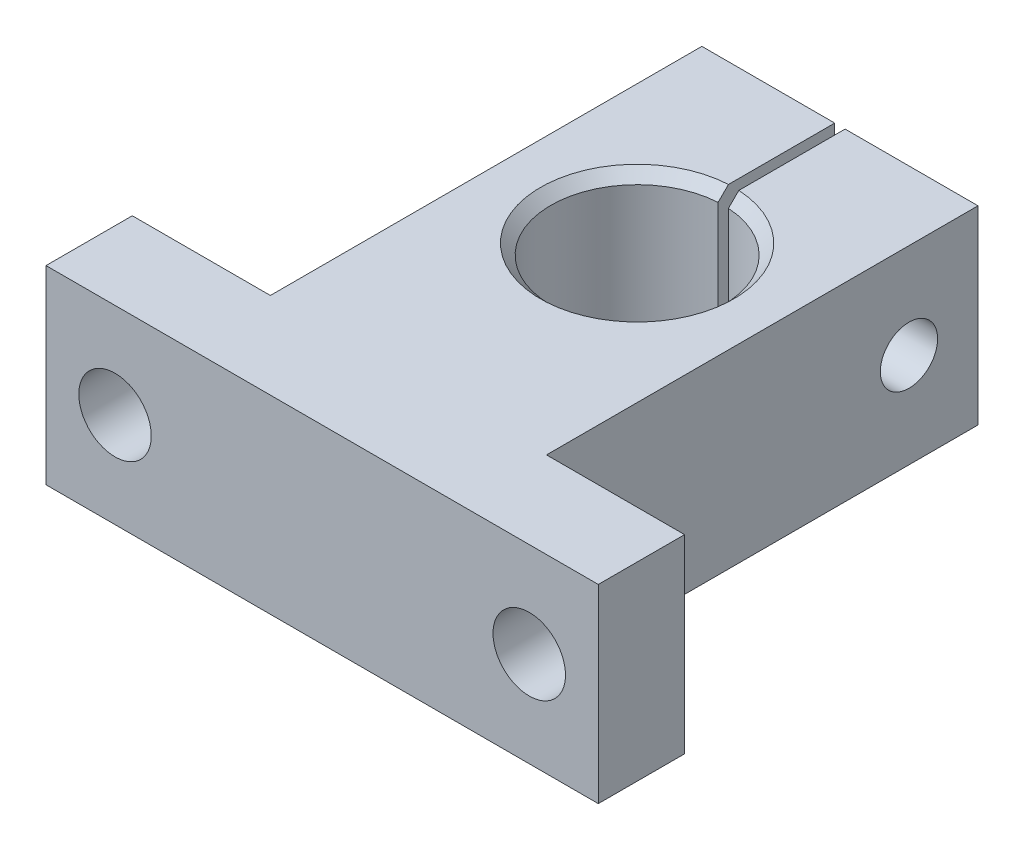
ISO-10303-21;
HEADER;
FILE_DESCRIPTION(('STEP AP214'),'2;1');
FILE_NAME('part.step','',(''),(''),'','','');
FILE_SCHEMA(('AUTOMOTIVE_DESIGN { 1 0 10303 214 1 1 1 1 }'));
ENDSEC;
DATA;
#1=APPLICATION_CONTEXT('core data for automotive mechanical design processes');
#2=APPLICATION_PROTOCOL_DEFINITION('international standard','automotive_design',2000,#1);
#3=PRODUCT_CONTEXT('',#1,'mechanical');
#4=PRODUCT('Part','Part','',(#3));
#5=PRODUCT_RELATED_PRODUCT_CATEGORY('part','',(#4));
#6=PRODUCT_DEFINITION_FORMATION('','',#4);
#7=PRODUCT_DEFINITION_CONTEXT('part definition',#1,'design');
#8=PRODUCT_DEFINITION('design','',#6,#7);
#9=PRODUCT_DEFINITION_SHAPE('','',#8);
#10=(LENGTH_UNIT() NAMED_UNIT(*) SI_UNIT(.MILLI.,.METRE.));
#11=(NAMED_UNIT(*) PLANE_ANGLE_UNIT() SI_UNIT($,.RADIAN.));
#12=(NAMED_UNIT(*) SI_UNIT($,.STERADIAN.) SOLID_ANGLE_UNIT());
#13=UNCERTAINTY_MEASURE_WITH_UNIT(LENGTH_MEASURE(1.E-05),#10,'distance_accuracy_value','');
#14=(GEOMETRIC_REPRESENTATION_CONTEXT(3) GLOBAL_UNCERTAINTY_ASSIGNED_CONTEXT((#13)) GLOBAL_UNIT_ASSIGNED_CONTEXT((#10,
#11,#12)) REPRESENTATION_CONTEXT('',''));
#15=CARTESIAN_POINT('',(0.,0.,0.));
#16=DIRECTION('',(0.,0.,1.));
#17=DIRECTION('',(1.,0.,0.));
#18=AXIS2_PLACEMENT_3D('',#15,#16,#17);
#19=CARTESIAN_POINT('',(20.32,13.97,23.1775));
#20=DIRECTION('',(0.,0.,-1.));
#21=DIRECTION('',(-1.,0.,0.));
#22=AXIS2_PLACEMENT_3D('',#19,#20,#21);
#23=PLANE('',#22);
#24=CARTESIAN_POINT('',(15.24,6.985,23.1775));
#25=DIRECTION('',(0.,0.,-1.));
#26=DIRECTION('',(-1.,0.,0.));
#27=AXIS2_PLACEMENT_3D('',#24,#25,#26);
#28=CIRCLE('',#27,2.667);
#29=CARTESIAN_POINT('',(12.573,6.985,23.1775));
#30=VERTEX_POINT('',#29);
#31=EDGE_CURVE('E337',#30,#30,#28,.T.);
#32=ORIENTED_EDGE('',*,*,#31,.T.);
#33=EDGE_LOOP('',(#32));
#34=FACE_BOUND('',#33,.T.);
#35=CARTESIAN_POINT('',(-15.24,6.985,23.1775));
#36=DIRECTION('',(0.,0.,-1.));
#37=DIRECTION('',(-1.,0.,0.));
#38=AXIS2_PLACEMENT_3D('',#35,#36,#37);
#39=CIRCLE('',#38,2.667);
#40=CARTESIAN_POINT('',(-17.907,6.985,23.1775));
#41=VERTEX_POINT('',#40);
#42=EDGE_CURVE('E431',#41,#41,#39,.T.);
#43=ORIENTED_EDGE('',*,*,#42,.T.);
#44=EDGE_LOOP('',(#43));
#45=FACE_BOUND('',#44,.T.);
#46=DIRECTION('',(1.,0.,0.));
#47=VECTOR('',#46,1.);
#48=CARTESIAN_POINT('',(20.32,0.,23.1775));
#49=LINE('',#48,#47);
#50=CARTESIAN_POINT('',(-20.32,0.,23.1775));
#51=VERTEX_POINT('',#50);
#52=CARTESIAN_POINT('',(20.32,0.,23.1775));
#53=VERTEX_POINT('',#52);
#54=EDGE_CURVE('E164',#51,#53,#49,.T.);
#55=ORIENTED_EDGE('',*,*,#54,.T.);
#56=DIRECTION('',(0.,-1.,0.));
#57=VECTOR('',#56,1.);
#58=CARTESIAN_POINT('',(20.32,13.97,23.1775));
#59=LINE('',#58,#57);
#60=CARTESIAN_POINT('',(20.32,13.97,23.1775));
#61=VERTEX_POINT('',#60);
#62=EDGE_CURVE('E145',#61,#53,#59,.T.);
#63=ORIENTED_EDGE('',*,*,#62,.F.);
#64=DIRECTION('',(1.,0.,0.));
#65=VECTOR('',#64,1.);
#66=CARTESIAN_POINT('',(20.32,13.97,23.1775));
#67=LINE('',#66,#65);
#68=CARTESIAN_POINT('',(-20.32,13.97,23.1775));
#69=VERTEX_POINT('',#68);
#70=EDGE_CURVE('E152',#69,#61,#67,.T.);
#71=ORIENTED_EDGE('',*,*,#70,.F.);
#72=DIRECTION('',(0.,-1.,0.));
#73=VECTOR('',#72,1.);
#74=CARTESIAN_POINT('',(-20.32,13.97,23.1775));
#75=LINE('',#74,#73);
#76=EDGE_CURVE('E297',#69,#51,#75,.T.);
#77=ORIENTED_EDGE('',*,*,#76,.T.);
#78=EDGE_LOOP('',(#55,#63,#71,#77));
#79=FACE_BOUND('',#78,.T.);
#80=ADVANCED_FACE('F35',(#34,#45,#79),#23,.F.);
#81=CARTESIAN_POINT('',(20.32,13.97,16.8275));
#82=DIRECTION('',(-1.,0.,0.));
#83=DIRECTION('',(0.,0.,1.));
#84=AXIS2_PLACEMENT_3D('',#81,#82,#83);
#85=PLANE('',#84);
#86=DIRECTION('',(0.,0.,-1.));
#87=VECTOR('',#86,1.);
#88=CARTESIAN_POINT('',(20.32,0.,16.8275));
#89=LINE('',#88,#87);
#90=CARTESIAN_POINT('',(20.32,0.,16.8275));
#91=VERTEX_POINT('',#90);
#92=EDGE_CURVE('E336',#53,#91,#89,.T.);
#93=ORIENTED_EDGE('',*,*,#92,.T.);
#94=DIRECTION('',(0.,-1.,0.));
#95=VECTOR('',#94,1.);
#96=CARTESIAN_POINT('',(20.32,13.97,16.8275));
#97=LINE('',#96,#95);
#98=CARTESIAN_POINT('',(20.32,13.97,16.8275));
#99=VERTEX_POINT('',#98);
#100=EDGE_CURVE('E148',#99,#91,#97,.T.);
#101=ORIENTED_EDGE('',*,*,#100,.F.);
#102=DIRECTION('',(0.,0.,-1.));
#103=VECTOR('',#102,1.);
#104=CARTESIAN_POINT('',(20.32,13.97,16.8275));
#105=LINE('',#104,#103);
#106=EDGE_CURVE('E141',#61,#99,#105,.T.);
#107=ORIENTED_EDGE('',*,*,#106,.F.);
#108=ORIENTED_EDGE('',*,*,#62,.T.);
#109=EDGE_LOOP('',(#93,#101,#107,#108));
#110=FACE_BOUND('',#109,.T.);
#111=ADVANCED_FACE('F143',(#110),#85,.F.);
#112=CARTESIAN_POINT('',(10.16,13.97,16.8275));
#113=DIRECTION('',(0.,0.,1.));
#114=DIRECTION('',(1.,0.,0.));
#115=AXIS2_PLACEMENT_3D('',#112,#113,#114);
#116=PLANE('',#115);
#117=CARTESIAN_POINT('',(15.24,6.985,16.8275));
#118=DIRECTION('',(0.,0.,1.));
#119=DIRECTION('',(1.,0.,0.));
#120=AXIS2_PLACEMENT_3D('',#117,#118,#119);
#121=CIRCLE('',#120,3.42900000000002);
#122=CARTESIAN_POINT('',(18.669,6.985,16.8275));
#123=VERTEX_POINT('',#122);
#124=EDGE_CURVE('E374',#123,#123,#121,.T.);
#125=ORIENTED_EDGE('',*,*,#124,.T.);
#126=EDGE_LOOP('',(#125));
#127=FACE_BOUND('',#126,.T.);
#128=DIRECTION('',(-1.,0.,0.));
#129=VECTOR('',#128,1.);
#130=CARTESIAN_POINT('',(10.16,0.,16.8275));
#131=LINE('',#130,#129);
#132=CARTESIAN_POINT('',(10.16,0.,16.8275));
#133=VERTEX_POINT('',#132);
#134=EDGE_CURVE('E275',#91,#133,#131,.T.);
#135=ORIENTED_EDGE('',*,*,#134,.T.);
#136=DIRECTION('',(0.,-1.,0.));
#137=VECTOR('',#136,1.);
#138=CARTESIAN_POINT('',(10.16,13.97,16.8275));
#139=LINE('',#138,#137);
#140=CARTESIAN_POINT('',(10.16,13.97,16.8275));
#141=VERTEX_POINT('',#140);
#142=EDGE_CURVE('E169',#141,#133,#139,.T.);
#143=ORIENTED_EDGE('',*,*,#142,.F.);
#144=DIRECTION('',(-1.,0.,0.));
#145=VECTOR('',#144,1.);
#146=CARTESIAN_POINT('',(10.16,13.97,16.8275));
#147=LINE('',#146,#145);
#148=EDGE_CURVE('E151',#99,#141,#147,.T.);
#149=ORIENTED_EDGE('',*,*,#148,.F.);
#150=ORIENTED_EDGE('',*,*,#100,.T.);
#151=EDGE_LOOP('',(#135,#143,#149,#150));
#152=FACE_BOUND('',#151,.T.);
#153=ADVANCED_FACE('F249',(#127,#152),#116,.F.);
#154=CARTESIAN_POINT('',(10.16,13.97,-14.9225));
#155=DIRECTION('',(-1.,0.,0.));
#156=DIRECTION('',(0.,0.,1.));
#157=AXIS2_PLACEMENT_3D('',#154,#155,#156);
#158=PLANE('',#157);
#159=CARTESIAN_POINT('',(10.16,6.985,-9.8425));
#160=DIRECTION('',(-1.,0.,0.));
#161=DIRECTION('',(0.,0.,1.));
#162=AXIS2_PLACEMENT_3D('',#159,#160,#161);
#163=CIRCLE('',#162,2.1082);
#164=CARTESIAN_POINT('',(10.16,6.985,-7.7343));
#165=VERTEX_POINT('',#164);
#166=EDGE_CURVE('E262',#165,#165,#163,.T.);
#167=ORIENTED_EDGE('',*,*,#166,.T.);
#168=EDGE_LOOP('',(#167));
#169=FACE_BOUND('',#168,.T.);
#170=DIRECTION('',(0.,0.,-1.));
#171=VECTOR('',#170,1.);
#172=CARTESIAN_POINT('',(10.16,0.,-14.9225));
#173=LINE('',#172,#171);
#174=CARTESIAN_POINT('',(10.16,0.,-14.9225));
#175=VERTEX_POINT('',#174);
#176=EDGE_CURVE('E266',#133,#175,#173,.T.);
#177=ORIENTED_EDGE('',*,*,#176,.T.);
#178=DIRECTION('',(0.,-1.,0.));
#179=VECTOR('',#178,1.);
#180=CARTESIAN_POINT('',(10.16,13.97,-14.9225));
#181=LINE('',#180,#179);
#182=CARTESIAN_POINT('',(10.16,13.97,-14.9225));
#183=VERTEX_POINT('',#182);
#184=EDGE_CURVE('E269',#183,#175,#181,.T.);
#185=ORIENTED_EDGE('',*,*,#184,.F.);
#186=DIRECTION('',(0.,0.,-1.));
#187=VECTOR('',#186,1.);
#188=CARTESIAN_POINT('',(10.16,13.97,-14.9225));
#189=LINE('',#188,#187);
#190=EDGE_CURVE('E325',#141,#183,#189,.T.);
#191=ORIENTED_EDGE('',*,*,#190,.F.);
#192=ORIENTED_EDGE('',*,*,#142,.T.);
#193=EDGE_LOOP('',(#177,#185,#191,#192));
#194=FACE_BOUND('',#193,.T.);
#195=ADVANCED_FACE('F251',(#169,#194),#158,.F.);
#196=CARTESIAN_POINT('',(10.16,13.97,-14.9225));
#197=DIRECTION('',(0.,0.,1.));
#198=DIRECTION('',(1.,0.,0.));
#199=AXIS2_PLACEMENT_3D('',#196,#197,#198);
#200=PLANE('',#199);
#201=DIRECTION('',(-1.,0.,0.));
#202=VECTOR('',#201,1.);
#203=CARTESIAN_POINT('',(10.16,0.,-14.9225));
#204=LINE('',#203,#202);
#205=CARTESIAN_POINT('',(0.381,0.,-14.9225));
#206=VERTEX_POINT('',#205);
#207=EDGE_CURVE('E274',#175,#206,#204,.T.);
#208=ORIENTED_EDGE('',*,*,#207,.T.);
#209=DIRECTION('',(0.,-1.,0.));
#210=VECTOR('',#209,1.);
#211=CARTESIAN_POINT('',(0.381,13.97,-14.9225));
#212=LINE('',#211,#210);
#213=CARTESIAN_POINT('',(0.381,13.97,-14.9225));
#214=VERTEX_POINT('',#213);
#215=EDGE_CURVE('E280',#214,#206,#212,.T.);
#216=ORIENTED_EDGE('',*,*,#215,.F.);
#217=DIRECTION('',(-1.,0.,0.));
#218=VECTOR('',#217,1.);
#219=CARTESIAN_POINT('',(10.16,13.97,-14.9225));
#220=LINE('',#219,#218);
#221=EDGE_CURVE('E279',#183,#214,#220,.T.);
#222=ORIENTED_EDGE('',*,*,#221,.F.);
#223=ORIENTED_EDGE('',*,*,#184,.T.);
#224=EDGE_LOOP('',(#208,#216,#222,#223));
#225=FACE_BOUND('',#224,.T.);
#226=ADVANCED_FACE('F216',(#225),#200,.F.);
#227=CARTESIAN_POINT('',(0.381,13.97,-6.33855969444163));
#228=DIRECTION('',(1.,0.,0.));
#229=DIRECTION('',(0.,0.,-1.));
#230=AXIS2_PLACEMENT_3D('',#227,#228,#229);
#231=PLANE('',#230);
#232=CARTESIAN_POINT('',(0.380999999999999,6.985,-9.8425));
#233=DIRECTION('',(1.,0.,0.));
#234=DIRECTION('',(0.,0.,-1.));
#235=AXIS2_PLACEMENT_3D('',#232,#233,#234);
#236=CIRCLE('',#235,2.1082);
#237=CARTESIAN_POINT('',(0.380999999999999,6.985,-11.9507));
#238=VERTEX_POINT('',#237);
#239=EDGE_CURVE('E175',#238,#238,#236,.T.);
#240=ORIENTED_EDGE('',*,*,#239,.T.);
#241=EDGE_LOOP('',(#240));
#242=FACE_BOUND('',#241,.T.);
#243=DIRECTION('',(0.,0.,1.));
#244=VECTOR('',#243,1.);
#245=CARTESIAN_POINT('',(0.381,0.,-6.33855969444163));
#246=LINE('',#245,#244);
#247=CARTESIAN_POINT('',(0.381,0.,-7.10178731024804));
#248=VERTEX_POINT('',#247);
#249=EDGE_CURVE('E283',#206,#248,#246,.T.);
#250=ORIENTED_EDGE('',*,*,#249,.T.);
#251=CARTESIAN_POINT('',(0.381,0.,-7.10178731024804));
#252=CARTESIAN_POINT('',(0.381,0.127011609253195,-6.97459429822383));
#253=CARTESIAN_POINT('',(0.381,0.254017413872309,-6.84739549090203));
#254=CARTESIAN_POINT('',(0.381,0.508017413872312,-6.59298628563323));
#255=CARTESIAN_POINT('',(0.381,0.635011609253199,-6.46577588768623));
#256=CARTESIAN_POINT('',(0.381,0.762000000000002,-6.33855969444163));
#257=B_SPLINE_CURVE_WITH_KNOTS('',3,(#251,#252,#253,#254,#255,#256),.UNSPECIFIED.,.F.,.F.,(4,2,
4),(0.,0.539249570161488,1.07849914045009),.UNSPECIFIED.);
#258=CARTESIAN_POINT('',(0.381,0.762000000000002,-6.33855969444163));
#259=VERTEX_POINT('',#258);
#260=EDGE_CURVE('E226',#248,#259,#257,.T.);
#261=ORIENTED_EDGE('',*,*,#260,.T.);
#262=DIRECTION('',(0.,-1.,0.));
#263=VECTOR('',#262,1.);
#264=CARTESIAN_POINT('',(0.381,13.97,-6.33855969444163));
#265=LINE('',#264,#263);
#266=CARTESIAN_POINT('',(0.381,13.208,-6.33855969444163));
#267=VERTEX_POINT('',#266);
#268=EDGE_CURVE('E314',#267,#259,#265,.T.);
#269=ORIENTED_EDGE('',*,*,#268,.F.);
#270=CARTESIAN_POINT('',(0.381,13.208,-6.33855969444163));
#271=CARTESIAN_POINT('',(0.381,13.3349883907468,-6.46577588768623));
#272=CARTESIAN_POINT('',(0.381,13.4619825861277,-6.59298628563322));
#273=CARTESIAN_POINT('',(0.381,13.7159825861277,-6.84739549090202));
#274=CARTESIAN_POINT('',(0.381,13.8429883907468,-6.97459429822382));
#275=CARTESIAN_POINT('',(0.381,13.97,-7.10178731024803));
#276=B_SPLINE_CURVE_WITH_KNOTS('',3,(#270,#271,#272,#273,#274,#275),.UNSPECIFIED.,.F.,.F.,(4,2,
4),(0.,0.5392495702886,1.07849914045008),.UNSPECIFIED.);
#277=CARTESIAN_POINT('',(0.381,13.97,-7.10178731024803));
#278=VERTEX_POINT('',#277);
#279=EDGE_CURVE('E51',#267,#278,#276,.T.);
#280=ORIENTED_EDGE('',*,*,#279,.T.);
#281=DIRECTION('',(0.,0.,1.));
#282=VECTOR('',#281,1.);
#283=CARTESIAN_POINT('',(0.381,13.97,-6.33855969444163));
#284=LINE('',#283,#282);
#285=EDGE_CURVE('E318',#214,#278,#284,.T.);
#286=ORIENTED_EDGE('',*,*,#285,.F.);
#287=ORIENTED_EDGE('',*,*,#215,.T.);
#288=EDGE_LOOP('',(#250,#261,#269,#280,#286,#287));
#289=FACE_BOUND('',#288,.T.);
#290=ADVANCED_FACE('F211',(#242,#289),#231,.F.);
#291=CARTESIAN_POINT('',(0.,13.97,0.));
#292=DIRECTION('',(0.,-1.,0.));
#293=DIRECTION('',(0.,0.,-1.));
#294=AXIS2_PLACEMENT_3D('',#291,#292,#293);
#295=CYLINDRICAL_SURFACE('',#294,6.35);
#296=ORIENTED_EDGE('',*,*,#268,.T.);
#297=CARTESIAN_POINT('',(0.,0.762000000000002,0.));
#298=DIRECTION('',(0.,1.,0.));
#299=DIRECTION('',(0.,0.,1.));
#300=AXIS2_PLACEMENT_3D('',#297,#298,#299);
#301=CIRCLE('',#300,6.35);
#302=CARTESIAN_POINT('',(-0.380999999999998,0.762000000000002,-6.33855969444163));
#303=VERTEX_POINT('',#302);
#304=EDGE_CURVE('E167',#259,#303,#301,.F.);
#305=ORIENTED_EDGE('',*,*,#304,.T.);
#306=DIRECTION('',(0.,-1.,0.));
#307=VECTOR('',#306,1.);
#308=CARTESIAN_POINT('',(-0.380999999999998,13.97,-6.33855969444163));
#309=LINE('',#308,#307);
#310=CARTESIAN_POINT('',(-0.380999999999998,13.208,-6.33855969444163));
#311=VERTEX_POINT('',#310);
#312=EDGE_CURVE('E311',#311,#303,#309,.T.);
#313=ORIENTED_EDGE('',*,*,#312,.F.);
#314=CARTESIAN_POINT('',(0.,13.208,0.));
#315=DIRECTION('',(0.,1.,0.));
#316=DIRECTION('',(0.,0.,1.));
#317=AXIS2_PLACEMENT_3D('',#314,#315,#316);
#318=CIRCLE('',#317,6.35);
#319=EDGE_CURVE('E165',#311,#267,#318,.T.);
#320=ORIENTED_EDGE('',*,*,#319,.T.);
#321=EDGE_LOOP('',(#296,#305,#313,#320));
#322=FACE_BOUND('',#321,.T.);
#323=ADVANCED_FACE('F205',(#322),#295,.F.);
#324=CARTESIAN_POINT('',(-0.381,13.97,-6.33855969444163));
#325=DIRECTION('',(-1.,0.,0.));
#326=DIRECTION('',(0.,0.,1.));
#327=AXIS2_PLACEMENT_3D('',#324,#325,#326);
#328=PLANE('',#327);
#329=CARTESIAN_POINT('',(-0.380999999999999,6.985,-9.8425));
#330=DIRECTION('',(-1.,0.,0.));
#331=DIRECTION('',(0.,0.,1.));
#332=AXIS2_PLACEMENT_3D('',#329,#330,#331);
#333=CIRCLE('',#332,2.1082);
#334=CARTESIAN_POINT('',(-0.380999999999999,6.985,-7.7343));
#335=VERTEX_POINT('',#334);
#336=EDGE_CURVE('E173',#335,#335,#333,.T.);
#337=ORIENTED_EDGE('',*,*,#336,.T.);
#338=EDGE_LOOP('',(#337));
#339=FACE_BOUND('',#338,.T.);
#340=ORIENTED_EDGE('',*,*,#312,.T.);
#341=CARTESIAN_POINT('',(-0.380999999999998,0.762000000000002,-6.33855969444163));
#342=CARTESIAN_POINT('',(-0.380999999999999,0.635011609253199,-6.46577588768623));
#343=CARTESIAN_POINT('',(-0.381,0.508017413872312,-6.59298628563323));
#344=CARTESIAN_POINT('',(-0.381,0.254017413872309,-6.84739549090203));
#345=CARTESIAN_POINT('',(-0.381,0.127011609253195,-6.97459429822383));
#346=CARTESIAN_POINT('',(-0.381,0.,-7.10178731024804));
#347=B_SPLINE_CURVE_WITH_KNOTS('',3,(#341,#342,#343,#344,#345,#346),.UNSPECIFIED.,.F.,.F.,(4,2,
4),(0.,0.539249570288607,1.07849914045009),.UNSPECIFIED.);
#348=CARTESIAN_POINT('',(-0.381,0.,-7.10178731024804));
#349=VERTEX_POINT('',#348);
#350=EDGE_CURVE('E188',#303,#349,#347,.T.);
#351=ORIENTED_EDGE('',*,*,#350,.T.);
#352=DIRECTION('',(0.,0.,-1.));
#353=VECTOR('',#352,1.);
#354=CARTESIAN_POINT('',(-0.381,0.,-6.33855969444163));
#355=LINE('',#354,#353);
#356=CARTESIAN_POINT('',(-0.381,0.,-14.9225));
#357=VERTEX_POINT('',#356);
#358=EDGE_CURVE('E285',#349,#357,#355,.T.);
#359=ORIENTED_EDGE('',*,*,#358,.T.);
#360=DIRECTION('',(0.,-1.,0.));
#361=VECTOR('',#360,1.);
#362=CARTESIAN_POINT('',(-0.381,13.97,-14.9225));
#363=LINE('',#362,#361);
#364=CARTESIAN_POINT('',(-0.381,13.97,-14.9225));
#365=VERTEX_POINT('',#364);
#366=EDGE_CURVE('E308',#365,#357,#363,.T.);
#367=ORIENTED_EDGE('',*,*,#366,.F.);
#368=DIRECTION('',(0.,0.,-1.));
#369=VECTOR('',#368,1.);
#370=CARTESIAN_POINT('',(-0.381,13.97,-6.33855969444163));
#371=LINE('',#370,#369);
#372=CARTESIAN_POINT('',(-0.381,13.97,-7.10178731024803));
#373=VERTEX_POINT('',#372);
#374=EDGE_CURVE('E321',#373,#365,#371,.T.);
#375=ORIENTED_EDGE('',*,*,#374,.F.);
#376=CARTESIAN_POINT('',(-0.381,13.97,-7.10178731024803));
#377=CARTESIAN_POINT('',(-0.381,13.8429883907468,-6.97459429822382));
#378=CARTESIAN_POINT('',(-0.381,13.7159825861277,-6.84739549090202));
#379=CARTESIAN_POINT('',(-0.381,13.4619825861277,-6.59298628563322));
#380=CARTESIAN_POINT('',(-0.381,13.3349883907468,-6.46577588768623));
#381=CARTESIAN_POINT('',(-0.381,13.208,-6.33855969444163));
#382=B_SPLINE_CURVE_WITH_KNOTS('',3,(#376,#377,#378,#379,#380,#381),.UNSPECIFIED.,.F.,.F.,(4,2,
4),(0.,0.539249570161481,1.07849914045008),.UNSPECIFIED.);
#383=EDGE_CURVE('E180',#373,#311,#382,.T.);
#384=ORIENTED_EDGE('',*,*,#383,.T.);
#385=EDGE_LOOP('',(#340,#351,#359,#367,#375,#384));
#386=FACE_BOUND('',#385,.T.);
#387=ADVANCED_FACE('F199',(#339,#386),#328,.F.);
#388=CARTESIAN_POINT('',(-0.381,13.97,-14.9225));
#389=DIRECTION('',(0.,0.,1.));
#390=DIRECTION('',(1.,0.,0.));
#391=AXIS2_PLACEMENT_3D('',#388,#389,#390);
#392=PLANE('',#391);
#393=DIRECTION('',(-1.,0.,0.));
#394=VECTOR('',#393,1.);
#395=CARTESIAN_POINT('',(-0.381,0.,-14.9225));
#396=LINE('',#395,#394);
#397=CARTESIAN_POINT('',(-10.16,0.,-14.9225));
#398=VERTEX_POINT('',#397);
#399=EDGE_CURVE('E290',#357,#398,#396,.T.);
#400=ORIENTED_EDGE('',*,*,#399,.T.);
#401=DIRECTION('',(0.,-1.,0.));
#402=VECTOR('',#401,1.);
#403=CARTESIAN_POINT('',(-10.16,13.97,-14.9225));
#404=LINE('',#403,#402);
#405=CARTESIAN_POINT('',(-10.16,13.97,-14.9225));
#406=VERTEX_POINT('',#405);
#407=EDGE_CURVE('E305',#406,#398,#404,.T.);
#408=ORIENTED_EDGE('',*,*,#407,.F.);
#409=DIRECTION('',(-1.,0.,0.));
#410=VECTOR('',#409,1.);
#411=CARTESIAN_POINT('',(-0.381,13.97,-14.9225));
#412=LINE('',#411,#410);
#413=EDGE_CURVE('E323',#365,#406,#412,.T.);
#414=ORIENTED_EDGE('',*,*,#413,.F.);
#415=ORIENTED_EDGE('',*,*,#366,.T.);
#416=EDGE_LOOP('',(#400,#408,#414,#415));
#417=FACE_BOUND('',#416,.T.);
#418=ADVANCED_FACE('F204',(#417),#392,.F.);
#419=CARTESIAN_POINT('',(-10.16,13.97,-14.9225));
#420=DIRECTION('',(1.,0.,0.));
#421=DIRECTION('',(0.,0.,-1.));
#422=AXIS2_PLACEMENT_3D('',#419,#420,#421);
#423=PLANE('',#422);
#424=CARTESIAN_POINT('',(-10.16,6.985,-9.8425));
#425=DIRECTION('',(1.,0.,0.));
#426=DIRECTION('',(0.,0.,-1.));
#427=AXIS2_PLACEMENT_3D('',#424,#425,#426);
#428=CIRCLE('',#427,4.57200000000003);
#429=CARTESIAN_POINT('',(-10.16,6.985,-14.4145));
#430=VERTEX_POINT('',#429);
#431=EDGE_CURVE('E365',#430,#430,#428,.T.);
#432=ORIENTED_EDGE('',*,*,#431,.T.);
#433=EDGE_LOOP('',(#432));
#434=FACE_BOUND('',#433,.T.);
#435=DIRECTION('',(0.,0.,1.));
#436=VECTOR('',#435,1.);
#437=CARTESIAN_POINT('',(-10.16,0.,-14.9225));
#438=LINE('',#437,#436);
#439=CARTESIAN_POINT('',(-10.16,0.,16.8275));
#440=VERTEX_POINT('',#439);
#441=EDGE_CURVE('E292',#398,#440,#438,.T.);
#442=ORIENTED_EDGE('',*,*,#441,.T.);
#443=DIRECTION('',(0.,-1.,0.));
#444=VECTOR('',#443,1.);
#445=CARTESIAN_POINT('',(-10.16,13.97,16.8275));
#446=LINE('',#445,#444);
#447=CARTESIAN_POINT('',(-10.16,13.97,16.8275));
#448=VERTEX_POINT('',#447);
#449=EDGE_CURVE('E302',#448,#440,#446,.T.);
#450=ORIENTED_EDGE('',*,*,#449,.F.);
#451=DIRECTION('',(0.,0.,1.));
#452=VECTOR('',#451,1.);
#453=CARTESIAN_POINT('',(-10.16,13.97,-14.9225));
#454=LINE('',#453,#452);
#455=EDGE_CURVE('E330',#406,#448,#454,.T.);
#456=ORIENTED_EDGE('',*,*,#455,.F.);
#457=ORIENTED_EDGE('',*,*,#407,.T.);
#458=EDGE_LOOP('',(#442,#450,#456,#457));
#459=FACE_BOUND('',#458,.T.);
#460=ADVANCED_FACE('F351',(#434,#459),#423,.F.);
#461=CARTESIAN_POINT('',(-20.32,13.97,16.8275));
#462=DIRECTION('',(0.,0.,1.));
#463=DIRECTION('',(1.,0.,0.));
#464=AXIS2_PLACEMENT_3D('',#461,#462,#463);
#465=PLANE('',#464);
#466=CARTESIAN_POINT('',(-15.24,6.985,16.8275));
#467=DIRECTION('',(0.,0.,1.));
#468=DIRECTION('',(1.,0.,0.));
#469=AXIS2_PLACEMENT_3D('',#466,#467,#468);
#470=CIRCLE('',#469,3.42900000000001);
#471=CARTESIAN_POINT('',(-11.811,6.985,16.8275));
#472=VERTEX_POINT('',#471);
#473=EDGE_CURVE('E11',#472,#472,#470,.T.);
#474=ORIENTED_EDGE('',*,*,#473,.T.);
#475=EDGE_LOOP('',(#474));
#476=FACE_BOUND('',#475,.T.);
#477=DIRECTION('',(-1.,0.,0.));
#478=VECTOR('',#477,1.);
#479=CARTESIAN_POINT('',(-20.32,0.,16.8275));
#480=LINE('',#479,#478);
#481=CARTESIAN_POINT('',(-20.32,0.,16.8275));
#482=VERTEX_POINT('',#481);
#483=EDGE_CURVE('E294',#440,#482,#480,.T.);
#484=ORIENTED_EDGE('',*,*,#483,.T.);
#485=DIRECTION('',(0.,-1.,0.));
#486=VECTOR('',#485,1.);
#487=CARTESIAN_POINT('',(-20.32,13.97,16.8275));
#488=LINE('',#487,#486);
#489=CARTESIAN_POINT('',(-20.32,13.97,16.8275));
#490=VERTEX_POINT('',#489);
#491=EDGE_CURVE('E299',#490,#482,#488,.T.);
#492=ORIENTED_EDGE('',*,*,#491,.F.);
#493=DIRECTION('',(-1.,0.,0.));
#494=VECTOR('',#493,1.);
#495=CARTESIAN_POINT('',(-20.32,13.97,16.8275));
#496=LINE('',#495,#494);
#497=EDGE_CURVE('E332',#448,#490,#496,.T.);
#498=ORIENTED_EDGE('',*,*,#497,.F.);
#499=ORIENTED_EDGE('',*,*,#449,.T.);
#500=EDGE_LOOP('',(#484,#492,#498,#499));
#501=FACE_BOUND('',#500,.T.);
#502=ADVANCED_FACE('F347',(#476,#501),#465,.F.);
#503=CARTESIAN_POINT('',(-20.32,13.97,23.1775));
#504=DIRECTION('',(1.,0.,0.));
#505=DIRECTION('',(0.,0.,-1.));
#506=AXIS2_PLACEMENT_3D('',#503,#504,#505);
#507=PLANE('',#506);
#508=DIRECTION('',(0.,0.,1.));
#509=VECTOR('',#508,1.);
#510=CARTESIAN_POINT('',(-20.32,0.,23.1775));
#511=LINE('',#510,#509);
#512=EDGE_CURVE('E161',#482,#51,#511,.T.);
#513=ORIENTED_EDGE('',*,*,#512,.T.);
#514=ORIENTED_EDGE('',*,*,#76,.F.);
#515=DIRECTION('',(0.,0.,1.));
#516=VECTOR('',#515,1.);
#517=CARTESIAN_POINT('',(-20.32,13.97,23.1775));
#518=LINE('',#517,#516);
#519=EDGE_CURVE('E157',#490,#69,#518,.T.);
#520=ORIENTED_EDGE('',*,*,#519,.F.);
#521=ORIENTED_EDGE('',*,*,#491,.T.);
#522=EDGE_LOOP('',(#513,#514,#520,#521));
#523=FACE_BOUND('',#522,.T.);
#524=ADVANCED_FACE('F343',(#523),#507,.F.);
#525=CARTESIAN_POINT('',(0.,13.97,0.));
#526=DIRECTION('',(0.,1.,0.));
#527=DIRECTION('',(0.,0.,1.));
#528=AXIS2_PLACEMENT_3D('',#525,#526,#527);
#529=PLANE('',#528);
#530=ORIENTED_EDGE('',*,*,#285,.T.);
#531=CARTESIAN_POINT('',(0.,13.97,0.));
#532=DIRECTION('',(0.,1.,0.));
#533=DIRECTION('',(0.,0.,1.));
#534=AXIS2_PLACEMENT_3D('',#531,#532,#533);
#535=CIRCLE('',#534,7.11199999999999);
#536=EDGE_CURVE('E232',#278,#373,#535,.F.);
#537=ORIENTED_EDGE('',*,*,#536,.T.);
#538=ORIENTED_EDGE('',*,*,#374,.T.);
#539=ORIENTED_EDGE('',*,*,#413,.T.);
#540=ORIENTED_EDGE('',*,*,#455,.T.);
#541=ORIENTED_EDGE('',*,*,#497,.T.);
#542=ORIENTED_EDGE('',*,*,#519,.T.);
#543=ORIENTED_EDGE('',*,*,#70,.T.);
#544=ORIENTED_EDGE('',*,*,#106,.T.);
#545=ORIENTED_EDGE('',*,*,#148,.T.);
#546=ORIENTED_EDGE('',*,*,#190,.T.);
#547=ORIENTED_EDGE('',*,*,#221,.T.);
#548=EDGE_LOOP('',(#530,#537,#538,#539,#540,#541,#542,#543,#544,#545,#546,#547));
#549=FACE_BOUND('',#548,.T.);
#550=ADVANCED_FACE('F155',(#549),#529,.T.);
#551=CARTESIAN_POINT('',(0.,0.,0.));
#552=DIRECTION('',(0.,1.,0.));
#553=DIRECTION('',(0.,0.,1.));
#554=AXIS2_PLACEMENT_3D('',#551,#552,#553);
#555=PLANE('',#554);
#556=ORIENTED_EDGE('',*,*,#358,.F.);
#557=CARTESIAN_POINT('',(0.,0.,0.));
#558=DIRECTION('',(0.,1.,0.));
#559=DIRECTION('',(0.,0.,1.));
#560=AXIS2_PLACEMENT_3D('',#557,#558,#559);
#561=CIRCLE('',#560,7.11200000000001);
#562=EDGE_CURVE('E59',#349,#248,#561,.T.);
#563=ORIENTED_EDGE('',*,*,#562,.T.);
#564=ORIENTED_EDGE('',*,*,#249,.F.);
#565=ORIENTED_EDGE('',*,*,#207,.F.);
#566=ORIENTED_EDGE('',*,*,#176,.F.);
#567=ORIENTED_EDGE('',*,*,#134,.F.);
#568=ORIENTED_EDGE('',*,*,#92,.F.);
#569=ORIENTED_EDGE('',*,*,#54,.F.);
#570=ORIENTED_EDGE('',*,*,#512,.F.);
#571=ORIENTED_EDGE('',*,*,#483,.F.);
#572=ORIENTED_EDGE('',*,*,#441,.F.);
#573=ORIENTED_EDGE('',*,*,#399,.F.);
#574=EDGE_LOOP('',(#556,#563,#564,#565,#566,#567,#568,#569,#570,#571,#572,#573));
#575=FACE_BOUND('',#574,.T.);
#576=ADVANCED_FACE('F282',(#575),#555,.F.);
#577=CARTESIAN_POINT('',(-15.24,6.985,30.7975));
#578=DIRECTION('',(0.,0.,-1.));
#579=DIRECTION('',(-1.,0.,0.));
#580=AXIS2_PLACEMENT_3D('',#577,#578,#579);
#581=CYLINDRICAL_SURFACE('',#580,2.667);
#582=CARTESIAN_POINT('',(-15.24,6.985,17.5895));
#583=DIRECTION('',(0.,0.,1.));
#584=DIRECTION('',(1.,0.,0.));
#585=AXIS2_PLACEMENT_3D('',#582,#583,#584);
#586=CIRCLE('',#585,2.667);
#587=CARTESIAN_POINT('',(-12.573,6.985,17.5895));
#588=VERTEX_POINT('',#587);
#589=EDGE_CURVE('E44',#588,#588,#586,.F.);
#590=ORIENTED_EDGE('',*,*,#589,.T.);
#591=EDGE_LOOP('',(#590));
#592=FACE_BOUND('',#591,.T.);
#593=ORIENTED_EDGE('',*,*,#42,.F.);
#594=EDGE_LOOP('',(#593));
#595=FACE_BOUND('',#594,.T.);
#596=ADVANCED_FACE('F379',(#592,#595),#581,.F.);
#597=CARTESIAN_POINT('',(15.24,6.985,30.7975));
#598=DIRECTION('',(0.,0.,-1.));
#599=DIRECTION('',(-1.,0.,0.));
#600=AXIS2_PLACEMENT_3D('',#597,#598,#599);
#601=CYLINDRICAL_SURFACE('',#600,2.667);
#602=CARTESIAN_POINT('',(15.24,6.985,17.5895));
#603=DIRECTION('',(0.,0.,1.));
#604=DIRECTION('',(1.,0.,0.));
#605=AXIS2_PLACEMENT_3D('',#602,#603,#604);
#606=CIRCLE('',#605,2.667);
#607=CARTESIAN_POINT('',(17.907,6.985,17.5895));
#608=VERTEX_POINT('',#607);
#609=EDGE_CURVE('E369',#608,#608,#606,.F.);
#610=ORIENTED_EDGE('',*,*,#609,.T.);
#611=EDGE_LOOP('',(#610));
#612=FACE_BOUND('',#611,.T.);
#613=ORIENTED_EDGE('',*,*,#31,.F.);
#614=EDGE_LOOP('',(#613));
#615=FACE_BOUND('',#614,.T.);
#616=ADVANCED_FACE('F407',(#612,#615),#601,.F.);
#617=CARTESIAN_POINT('',(-5.334,6.985,-9.8425));
#618=DIRECTION('',(-1.,0.,0.));
#619=DIRECTION('',(0.,0.,1.));
#620=AXIS2_PLACEMENT_3D('',#617,#618,#619);
#621=CYLINDRICAL_SURFACE('',#620,3.81);
#622=CARTESIAN_POINT('',(-9.39799999999998,6.985,-9.8425));
#623=DIRECTION('',(1.,0.,0.));
#624=DIRECTION('',(0.,0.,-1.));
#625=AXIS2_PLACEMENT_3D('',#622,#623,#624);
#626=CIRCLE('',#625,3.81);
#627=CARTESIAN_POINT('',(-9.39799999999998,6.985,-6.0325));
#628=VERTEX_POINT('',#627);
#629=EDGE_CURVE('E363',#628,#628,#626,.F.);
#630=CARTESIAN_POINT('',(-5.334,6.985,-9.8425));
#631=DIRECTION('',(-1.,0.,0.));
#632=DIRECTION('',(0.,0.,1.));
#633=AXIS2_PLACEMENT_3D('',#630,#631,#632);
#634=CIRCLE('',#633,3.81);
#635=CARTESIAN_POINT('',(-5.334,6.985,-6.0325));
#636=VERTEX_POINT('',#635);
#637=EDGE_CURVE('E428',#636,#636,#634,.T.);
#638=CARTESIAN_POINT('',(-9.39799999999998,6.985,-6.0325));
#639=CARTESIAN_POINT('',(-9.35566666666665,6.985,-6.0325));
#640=CARTESIAN_POINT('',(-9.31333333333331,6.985,-6.0325));
#641=CARTESIAN_POINT('',(-9.22866666666665,6.985,-6.0325));
#642=CARTESIAN_POINT('',(-9.18633333333332,6.985,-6.0325));
#643=CARTESIAN_POINT('',(-9.10166666666665,6.985,-6.0325));
#644=CARTESIAN_POINT('',(-9.05933333333332,6.985,-6.0325));
#645=CARTESIAN_POINT('',(-8.97466666666665,6.985,-6.0325));
#646=CARTESIAN_POINT('',(-8.93233333333332,6.985,-6.0325));
#647=CARTESIAN_POINT('',(-8.84766666666665,6.985,-6.0325));
#648=CARTESIAN_POINT('',(-8.80533333333332,6.985,-6.0325));
#649=CARTESIAN_POINT('',(-8.72066666666665,6.985,-6.0325));
#650=CARTESIAN_POINT('',(-8.67833333333332,6.985,-6.0325));
#651=CARTESIAN_POINT('',(-8.59366666666665,6.985,-6.0325));
#652=CARTESIAN_POINT('',(-8.55133333333332,6.985,-6.0325));
#653=CARTESIAN_POINT('',(-8.46666666666665,6.985,-6.0325));
#654=CARTESIAN_POINT('',(-8.42433333333332,6.985,-6.0325));
#655=CARTESIAN_POINT('',(-8.33966666666665,6.985,-6.0325));
#656=CARTESIAN_POINT('',(-8.29733333333332,6.985,-6.0325));
#657=CARTESIAN_POINT('',(-8.21266666666665,6.985,-6.0325));
#658=CARTESIAN_POINT('',(-8.17033333333332,6.985,-6.0325));
#659=CARTESIAN_POINT('',(-8.08566666666665,6.985,-6.0325));
#660=CARTESIAN_POINT('',(-8.04333333333332,6.985,-6.0325));
#661=CARTESIAN_POINT('',(-7.95866666666665,6.985,-6.0325));
#662=CARTESIAN_POINT('',(-7.91633333333332,6.985,-6.0325));
#663=CARTESIAN_POINT('',(-7.83166666666666,6.985,-6.0325));
#664=CARTESIAN_POINT('',(-7.78933333333332,6.985,-6.0325));
#665=CARTESIAN_POINT('',(-7.70466666666666,6.985,-6.0325));
#666=CARTESIAN_POINT('',(-7.66233333333332,6.985,-6.0325));
#667=CARTESIAN_POINT('',(-7.57766666666666,6.985,-6.0325));
#668=CARTESIAN_POINT('',(-7.53533333333332,6.985,-6.0325));
#669=CARTESIAN_POINT('',(-7.45066666666666,6.985,-6.0325));
#670=CARTESIAN_POINT('',(-7.40833333333332,6.985,-6.0325));
#671=CARTESIAN_POINT('',(-7.32366666666666,6.985,-6.0325));
#672=CARTESIAN_POINT('',(-7.28133333333332,6.985,-6.0325));
#673=CARTESIAN_POINT('',(-7.19666666666666,6.985,-6.0325));
#674=CARTESIAN_POINT('',(-7.15433333333332,6.985,-6.0325));
#675=CARTESIAN_POINT('',(-7.06966666666666,6.985,-6.0325));
#676=CARTESIAN_POINT('',(-7.02733333333333,6.985,-6.0325));
#677=CARTESIAN_POINT('',(-6.94266666666666,6.985,-6.0325));
#678=CARTESIAN_POINT('',(-6.90033333333333,6.985,-6.0325));
#679=CARTESIAN_POINT('',(-6.81566666666666,6.985,-6.0325));
#680=CARTESIAN_POINT('',(-6.77333333333333,6.985,-6.0325));
#681=CARTESIAN_POINT('',(-6.68866666666666,6.985,-6.0325));
#682=CARTESIAN_POINT('',(-6.64633333333333,6.985,-6.0325));
#683=CARTESIAN_POINT('',(-6.56166666666666,6.985,-6.0325));
#684=CARTESIAN_POINT('',(-6.51933333333333,6.985,-6.0325));
#685=CARTESIAN_POINT('',(-6.43466666666666,6.985,-6.0325));
#686=CARTESIAN_POINT('',(-6.39233333333333,6.985,-6.0325));
#687=CARTESIAN_POINT('',(-6.30766666666666,6.985,-6.0325));
#688=CARTESIAN_POINT('',(-6.26533333333333,6.985,-6.0325));
#689=CARTESIAN_POINT('',(-6.18066666666666,6.985,-6.0325));
#690=CARTESIAN_POINT('',(-6.13833333333333,6.985,-6.0325));
#691=CARTESIAN_POINT('',(-6.05366666666666,6.985,-6.0325));
#692=CARTESIAN_POINT('',(-6.01133333333333,6.985,-6.0325));
#693=CARTESIAN_POINT('',(-5.92666666666666,6.985,-6.0325));
#694=CARTESIAN_POINT('',(-5.88433333333333,6.985,-6.0325));
#695=CARTESIAN_POINT('',(-5.79966666666666,6.985,-6.0325));
#696=CARTESIAN_POINT('',(-5.75733333333333,6.985,-6.0325));
#697=CARTESIAN_POINT('',(-5.67266666666666,6.985,-6.0325));
#698=CARTESIAN_POINT('',(-5.63033333333333,6.985,-6.0325));
#699=CARTESIAN_POINT('',(-5.54566666666666,6.985,-6.0325));
#700=CARTESIAN_POINT('',(-5.50333333333333,6.985,-6.0325));
#701=CARTESIAN_POINT('',(-5.41866666666666,6.985,-6.0325));
#702=CARTESIAN_POINT('',(-5.37633333333333,6.985,-6.0325));
#703=CARTESIAN_POINT('',(-5.334,6.985,-6.0325));
#704=B_SPLINE_CURVE_WITH_KNOTS('',3,(#638,#639,#640,#641,#642,#643,#644,#645,#646,#647,#648,
#649,#650,#651,#652,#653,#654,#655,#656,#657,#658,#659,#660,#661,#662,#663,#664,#665,#666,#667,
#668,#669,#670,#671,#672,#673,#674,#675,#676,#677,#678,#679,#680,#681,#682,#683,#684,#685,#686,
#687,#688,#689,#690,#691,#692,#693,#694,#695,#696,#697,#698,#699,#700,#701,#702,#703),
.UNSPECIFIED.,.F.,.F.,(4,2,2,2,2,2,2,2,2,2,2,2,2,2,2,2,2,2,2,2,2,2,2,2,2,2,2,2,2,2,2,2,4),(0.,
0.127,0.253999999999999,0.380999999999998,0.507999999999998,0.634999999999997,0.761999999999997,
0.888999999999996,1.01599999999999,1.14299999999999,1.27,1.39699999999999,1.52399999999999,
1.65099999999999,1.77799999999999,1.90499999999999,2.03199999999999,2.15899999999999,
2.28599999999999,2.41299999999999,2.53999999999999,2.66699999999999,2.79399999999999,
2.92099999999999,3.04799999999999,3.17499999999999,3.30199999999999,3.42899999999999,
3.55599999999998,3.68299999999998,3.80999999999998,3.93699999999998,4.06399999999998),.UNSPECIFIED.);
#705=EDGE_CURVE('BSEAM410',#628,#636,#704,.T.);
#706=ORIENTED_EDGE('',*,*,#629,.T.);
#707=ORIENTED_EDGE('',*,*,#637,.F.);
#708=ORIENTED_EDGE('',*,*,#705,.T.);
#709=ORIENTED_EDGE('',*,*,#705,.F.);
#710=EDGE_LOOP('',(#706,#708,#707,#709));
#711=FACE_BOUND('',#710,.T.);
#712=ADVANCED_FACE('F410',(#711),#621,.F.);
#713=CARTESIAN_POINT('',(-5.334,6.985,-9.8425));
#714=DIRECTION('',(-1.,0.,0.));
#715=DIRECTION('',(0.,0.,1.));
#716=AXIS2_PLACEMENT_3D('',#713,#714,#715);
#717=PLANE('',#716);
#718=CARTESIAN_POINT('',(-5.334,6.985,-9.8425));
#719=DIRECTION('',(-1.,0.,0.));
#720=DIRECTION('',(0.,0.,1.));
#721=AXIS2_PLACEMENT_3D('',#718,#719,#720);
#722=CIRCLE('',#721,2.1082);
#723=CARTESIAN_POINT('',(-5.334,6.985,-7.7343));
#724=VERTEX_POINT('',#723);
#725=EDGE_CURVE('E176',#724,#724,#722,.T.);
#726=ORIENTED_EDGE('',*,*,#725,.F.);
#727=EDGE_LOOP('',(#726));
#728=FACE_BOUND('',#727,.T.);
#729=ORIENTED_EDGE('',*,*,#637,.T.);
#730=EDGE_LOOP('',(#729));
#731=FACE_BOUND('',#730,.T.);
#732=ADVANCED_FACE('F414',(#728,#731),#717,.T.);
#733=CARTESIAN_POINT('',(11.938,6.985,-9.8425));
#734=DIRECTION('',(-1.,0.,0.));
#735=DIRECTION('',(0.,0.,1.));
#736=AXIS2_PLACEMENT_3D('',#733,#734,#735);
#737=CYLINDRICAL_SURFACE('',#736,2.1082);
#738=ORIENTED_EDGE('',*,*,#725,.T.);
#739=EDGE_LOOP('',(#738));
#740=FACE_BOUND('',#739,.T.);
#741=ORIENTED_EDGE('',*,*,#336,.F.);
#742=EDGE_LOOP('',(#741));
#743=FACE_BOUND('',#742,.T.);
#744=ADVANCED_FACE('F417',(#740,#743),#737,.F.);
#745=ORIENTED_EDGE('',*,*,#239,.F.);
#746=EDGE_LOOP('',(#745));
#747=FACE_BOUND('',#746,.T.);
#748=ORIENTED_EDGE('',*,*,#166,.F.);
#749=EDGE_LOOP('',(#748));
#750=FACE_BOUND('',#749,.T.);
#751=ADVANCED_FACE('F241',(#747,#750),#737,.F.);
#752=CARTESIAN_POINT('',(0.,0.762000000000002,0.));
#753=DIRECTION('',(0.,-1.,0.));
#754=DIRECTION('',(0.,0.,-1.));
#755=AXIS2_PLACEMENT_3D('',#752,#753,#754);
#756=CONICAL_SURFACE('',#755,6.35,0.785398163397452);
#757=ORIENTED_EDGE('',*,*,#260,.F.);
#758=ORIENTED_EDGE('',*,*,#562,.F.);
#759=ORIENTED_EDGE('',*,*,#350,.F.);
#760=ORIENTED_EDGE('',*,*,#304,.F.);
#761=EDGE_LOOP('',(#757,#758,#759,#760));
#762=FACE_BOUND('',#761,.T.);
#763=ADVANCED_FACE('F235',(#762),#756,.F.);
#764=CARTESIAN_POINT('',(0.,13.97,0.));
#765=DIRECTION('',(0.,1.,0.));
#766=DIRECTION('',(0.,0.,1.));
#767=AXIS2_PLACEMENT_3D('',#764,#765,#766);
#768=CONICAL_SURFACE('',#767,7.11199999999999,0.785398163397445);
#769=ORIENTED_EDGE('',*,*,#279,.F.);
#770=ORIENTED_EDGE('',*,*,#319,.F.);
#771=ORIENTED_EDGE('',*,*,#383,.F.);
#772=ORIENTED_EDGE('',*,*,#536,.F.);
#773=EDGE_LOOP('',(#769,#770,#771,#772));
#774=FACE_BOUND('',#773,.T.);
#775=ADVANCED_FACE('F196',(#774),#768,.F.);
#776=CARTESIAN_POINT('',(-9.39799999999998,6.985,-9.8425));
#777=DIRECTION('',(-1.,0.,0.));
#778=DIRECTION('',(0.,0.,1.));
#779=AXIS2_PLACEMENT_3D('',#776,#777,#778);
#780=CONICAL_SURFACE('',#779,3.81,0.785398163397453);
#781=ORIENTED_EDGE('',*,*,#431,.F.);
#782=EDGE_LOOP('',(#781));
#783=FACE_BOUND('',#782,.T.);
#784=ORIENTED_EDGE('',*,*,#629,.F.);
#785=EDGE_LOOP('',(#784));
#786=FACE_BOUND('',#785,.T.);
#787=ADVANCED_FACE('F388',(#783,#786),#780,.F.);
#788=CARTESIAN_POINT('',(15.24,6.985,17.5895));
#789=DIRECTION('',(0.,0.,-1.));
#790=DIRECTION('',(-1.,0.,0.));
#791=AXIS2_PLACEMENT_3D('',#788,#789,#790);
#792=CONICAL_SURFACE('',#791,2.667,0.785398163397454);
#793=ORIENTED_EDGE('',*,*,#124,.F.);
#794=EDGE_LOOP('',(#793));
#795=FACE_BOUND('',#794,.T.);
#796=ORIENTED_EDGE('',*,*,#609,.F.);
#797=EDGE_LOOP('',(#796));
#798=FACE_BOUND('',#797,.T.);
#799=ADVANCED_FACE('F383',(#795,#798),#792,.F.);
#800=CARTESIAN_POINT('',(-15.24,6.985,17.5895));
#801=DIRECTION('',(0.,0.,-1.));
#802=DIRECTION('',(-1.,0.,0.));
#803=AXIS2_PLACEMENT_3D('',#800,#801,#802);
#804=CONICAL_SURFACE('',#803,2.667,0.785398163397451);
#805=ORIENTED_EDGE('',*,*,#473,.F.);
#806=EDGE_LOOP('',(#805));
#807=FACE_BOUND('',#806,.T.);
#808=ORIENTED_EDGE('',*,*,#589,.F.);
#809=EDGE_LOOP('',(#808));
#810=FACE_BOUND('',#809,.T.);
#811=ADVANCED_FACE('F38',(#807,#810),#804,.F.);
#812=CLOSED_SHELL('',(#80,#111,#153,#195,#226,#290,#323,#387,#418,#460,#502,#524,#550,#576,#596,
#616,#712,#732,#744,#751,#763,#775,#787,#799,#811));
#813=MANIFOLD_SOLID_BREP('B2',#812);
#814=ADVANCED_BREP_SHAPE_REPRESENTATION('',(#18,#813),#14);
#815=SHAPE_DEFINITION_REPRESENTATION(#9,#814);
ENDSEC;
END-ISO-10303-21;
